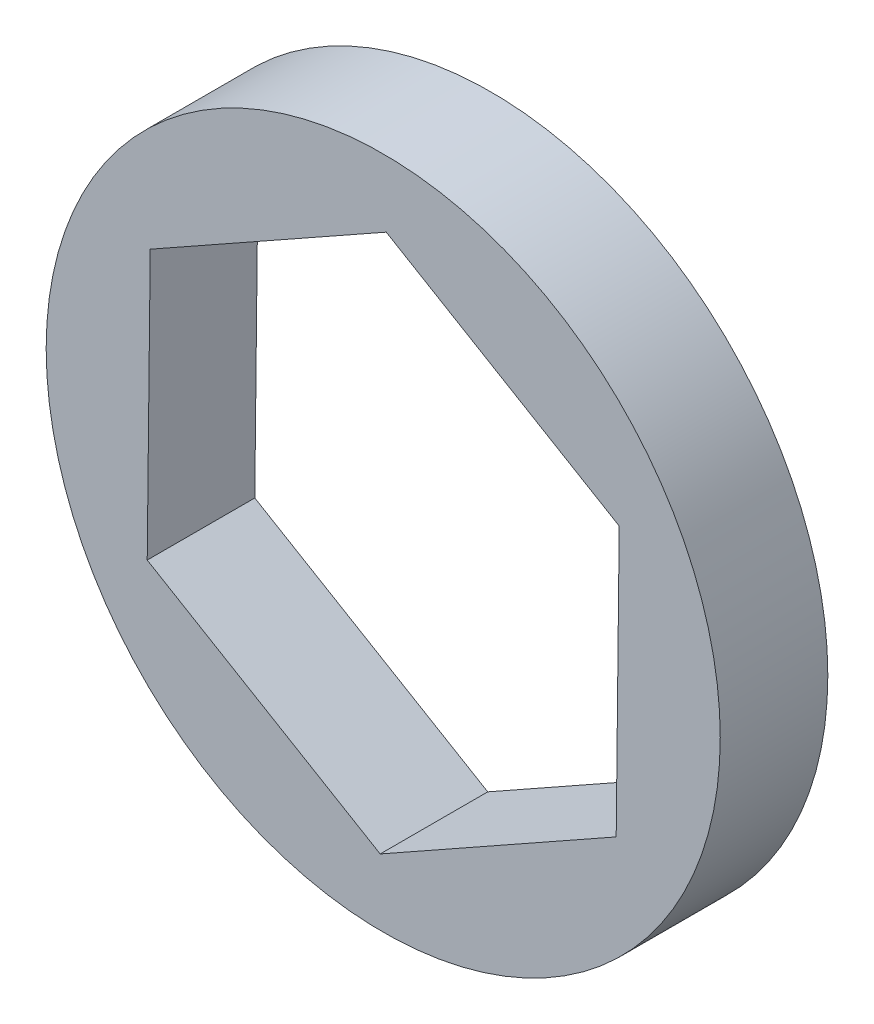
ISO-10303-21;
HEADER;
FILE_DESCRIPTION(('STEP AP214'),'2;1');
FILE_NAME('part.step','',(''),(''),'','','');
FILE_SCHEMA(('AUTOMOTIVE_DESIGN { 1 0 10303 214 1 1 1 1 }'));
ENDSEC;
DATA;
#1=APPLICATION_CONTEXT('core data for automotive mechanical design processes');
#2=APPLICATION_PROTOCOL_DEFINITION('international standard','automotive_design',2000,#1);
#3=PRODUCT_CONTEXT('',#1,'mechanical');
#4=PRODUCT('Part','Part','',(#3));
#5=PRODUCT_RELATED_PRODUCT_CATEGORY('part','',(#4));
#6=PRODUCT_DEFINITION_FORMATION('','',#4);
#7=PRODUCT_DEFINITION_CONTEXT('part definition',#1,'design');
#8=PRODUCT_DEFINITION('design','',#6,#7);
#9=PRODUCT_DEFINITION_SHAPE('','',#8);
#10=(LENGTH_UNIT() NAMED_UNIT(*) SI_UNIT(.MILLI.,.METRE.));
#11=(NAMED_UNIT(*) PLANE_ANGLE_UNIT() SI_UNIT($,.RADIAN.));
#12=(NAMED_UNIT(*) SI_UNIT($,.STERADIAN.) SOLID_ANGLE_UNIT());
#13=UNCERTAINTY_MEASURE_WITH_UNIT(LENGTH_MEASURE(1.E-05),#10,'distance_accuracy_value','');
#14=(GEOMETRIC_REPRESENTATION_CONTEXT(3) GLOBAL_UNCERTAINTY_ASSIGNED_CONTEXT((#13)) GLOBAL_UNIT_ASSIGNED_CONTEXT((#10,
#11,#12)) REPRESENTATION_CONTEXT('',''));
#15=CARTESIAN_POINT('',(0.,0.,0.));
#16=DIRECTION('',(0.,0.,1.));
#17=DIRECTION('',(1.,0.,0.));
#18=AXIS2_PLACEMENT_3D('',#15,#16,#17);
#19=CARTESIAN_POINT('',(0.,0.,3.));
#20=DIRECTION('',(0.,0.,1.));
#21=DIRECTION('',(1.,0.,0.));
#22=AXIS2_PLACEMENT_3D('',#19,#20,#21);
#23=PLANE('',#22);
#24=CARTESIAN_POINT('',(0.,0.,3.));
#25=DIRECTION('',(0.,0.,1.));
#26=DIRECTION('',(1.,0.,0.));
#27=AXIS2_PLACEMENT_3D('',#24,#25,#26);
#28=CIRCLE('',#27,9.4);
#29=CARTESIAN_POINT('',(9.4,0.,3.));
#30=VERTEX_POINT('',#29);
#31=EDGE_CURVE('E11',#30,#30,#28,.T.);
#32=ORIENTED_EDGE('',*,*,#31,.T.);
#33=EDGE_LOOP('',(#32));
#34=FACE_BOUND('',#33,.T.);
#35=DIRECTION('',(0.0112070766876811,0.999937198744059,0.));
#36=VECTOR('',#35,1.);
#37=CARTESIAN_POINT('',(6.49727280661045,-3.84892791261156,3.));
#38=LINE('',#37,#36);
#39=CARTESIAN_POINT('',(6.49727280661045,-3.84892791261156,3.));
#40=VERTEX_POINT('',#39);
#41=CARTESIAN_POINT('',(6.58190575296185,3.70233934953669,3.));
#42=VERTEX_POINT('',#41);
#43=EDGE_CURVE('E95',#40,#42,#38,.T.);
#44=ORIENTED_EDGE('',*,*,#43,.F.);
#45=DIRECTION('',(0.871574554645245,0.490262986258337,0.));
#46=VECTOR('',#45,1.);
#47=CARTESIAN_POINT('',(-0.0846329463513975,-7.55126726214825,3.));
#48=LINE('',#47,#46);
#49=CARTESIAN_POINT('',(-0.0846329463513975,-7.55126726214825,3.));
#50=VERTEX_POINT('',#49);
#51=EDGE_CURVE('E87',#50,#40,#48,.T.);
#52=ORIENTED_EDGE('',*,*,#51,.F.);
#53=DIRECTION('',(0.860367477957564,-0.509674212485722,0.));
#54=VECTOR('',#53,1.);
#55=CARTESIAN_POINT('',(-6.58190575296185,-3.70233934953669,3.));
#56=LINE('',#55,#54);
#57=CARTESIAN_POINT('',(-6.58190575296185,-3.70233934953669,3.));
#58=VERTEX_POINT('',#57);
#59=EDGE_CURVE('E115',#58,#50,#56,.T.);
#60=ORIENTED_EDGE('',*,*,#59,.F.);
#61=DIRECTION('',(-0.0112070766876816,-0.999937198744059,0.));
#62=VECTOR('',#61,1.);
#63=CARTESIAN_POINT('',(-6.49727280661045,3.84892791261156,3.));
#64=LINE('',#63,#62);
#65=CARTESIAN_POINT('',(-6.49727280661045,3.84892791261156,3.));
#66=VERTEX_POINT('',#65);
#67=EDGE_CURVE('E113',#66,#58,#64,.T.);
#68=ORIENTED_EDGE('',*,*,#67,.F.);
#69=DIRECTION('',(-0.871574554645245,-0.490262986258337,0.));
#70=VECTOR('',#69,1.);
#71=CARTESIAN_POINT('',(0.0846329463513967,7.55126726214825,3.));
#72=LINE('',#71,#70);
#73=CARTESIAN_POINT('',(0.0846329463513967,7.55126726214825,3.));
#74=VERTEX_POINT('',#73);
#75=EDGE_CURVE('E109',#74,#66,#72,.T.);
#76=ORIENTED_EDGE('',*,*,#75,.F.);
#77=DIRECTION('',(-0.860367477957564,0.509674212485722,0.));
#78=VECTOR('',#77,1.);
#79=CARTESIAN_POINT('',(6.58190575296185,3.70233934953669,3.));
#80=LINE('',#79,#78);
#81=EDGE_CURVE('E107',#42,#74,#80,.T.);
#82=ORIENTED_EDGE('',*,*,#81,.F.);
#83=EDGE_LOOP('',(#44,#52,#60,#68,#76,#82));
#84=FACE_BOUND('',#83,.T.);
#85=ADVANCED_FACE('F34',(#34,#84),#23,.T.);
#86=CARTESIAN_POINT('',(0.,0.,0.));
#87=DIRECTION('',(0.,0.,1.));
#88=DIRECTION('',(1.,0.,0.));
#89=AXIS2_PLACEMENT_3D('',#86,#87,#88);
#90=PLANE('',#89);
#91=CARTESIAN_POINT('',(0.,0.,0.));
#92=DIRECTION('',(0.,0.,1.));
#93=DIRECTION('',(1.,0.,0.));
#94=AXIS2_PLACEMENT_3D('',#91,#92,#93);
#95=CIRCLE('',#94,9.4);
#96=CARTESIAN_POINT('',(9.4,0.,0.));
#97=VERTEX_POINT('',#96);
#98=EDGE_CURVE('E38',#97,#97,#95,.T.);
#99=ORIENTED_EDGE('',*,*,#98,.F.);
#100=EDGE_LOOP('',(#99));
#101=FACE_BOUND('',#100,.T.);
#102=DIRECTION('',(0.871574554645245,0.490262986258337,0.));
#103=VECTOR('',#102,1.);
#104=CARTESIAN_POINT('',(-0.0846329463513975,-7.55126726214825,0.));
#105=LINE('',#104,#103);
#106=CARTESIAN_POINT('',(-0.0846329463513977,-7.55126726214825,0.));
#107=VERTEX_POINT('',#106);
#108=CARTESIAN_POINT('',(6.49727280661045,-3.84892791261156,0.));
#109=VERTEX_POINT('',#108);
#110=EDGE_CURVE('E57',#107,#109,#105,.T.);
#111=ORIENTED_EDGE('',*,*,#110,.T.);
#112=DIRECTION('',(0.0112070766876811,0.999937198744059,0.));
#113=VECTOR('',#112,1.);
#114=CARTESIAN_POINT('',(6.49727280661045,-3.84892791261156,0.));
#115=LINE('',#114,#113);
#116=CARTESIAN_POINT('',(6.58190575296185,3.70233934953669,0.));
#117=VERTEX_POINT('',#116);
#118=EDGE_CURVE('E102',#109,#117,#115,.T.);
#119=ORIENTED_EDGE('',*,*,#118,.T.);
#120=DIRECTION('',(-0.860367477957564,0.509674212485722,0.));
#121=VECTOR('',#120,1.);
#122=CARTESIAN_POINT('',(6.58190575296185,3.70233934953669,0.));
#123=LINE('',#122,#121);
#124=CARTESIAN_POINT('',(0.0846329463513967,7.55126726214825,0.));
#125=VERTEX_POINT('',#124);
#126=EDGE_CURVE('E119',#117,#125,#123,.T.);
#127=ORIENTED_EDGE('',*,*,#126,.T.);
#128=DIRECTION('',(-0.871574554645245,-0.490262986258337,0.));
#129=VECTOR('',#128,1.);
#130=CARTESIAN_POINT('',(0.0846329463513967,7.55126726214825,0.));
#131=LINE('',#130,#129);
#132=CARTESIAN_POINT('',(-6.49727280661045,3.84892791261156,0.));
#133=VERTEX_POINT('',#132);
#134=EDGE_CURVE('E122',#125,#133,#131,.T.);
#135=ORIENTED_EDGE('',*,*,#134,.T.);
#136=DIRECTION('',(-0.0112070766876816,-0.999937198744059,0.));
#137=VECTOR('',#136,1.);
#138=CARTESIAN_POINT('',(-6.49727280661045,3.84892791261156,0.));
#139=LINE('',#138,#137);
#140=CARTESIAN_POINT('',(-6.58190575296185,-3.70233934953669,0.));
#141=VERTEX_POINT('',#140);
#142=EDGE_CURVE('E125',#133,#141,#139,.T.);
#143=ORIENTED_EDGE('',*,*,#142,.T.);
#144=DIRECTION('',(0.860367477957564,-0.509674212485722,0.));
#145=VECTOR('',#144,1.);
#146=CARTESIAN_POINT('',(-6.58190575296185,-3.70233934953669,0.));
#147=LINE('',#146,#145);
#148=EDGE_CURVE('E96',#141,#107,#147,.T.);
#149=ORIENTED_EDGE('',*,*,#148,.T.);
#150=EDGE_LOOP('',(#111,#119,#127,#135,#143,#149));
#151=FACE_BOUND('',#150,.T.);
#152=ADVANCED_FACE('F142',(#101,#151),#90,.F.);
#153=CARTESIAN_POINT('',(0.,0.,3.));
#154=DIRECTION('',(0.,0.,-1.));
#155=DIRECTION('',(-1.,0.,0.));
#156=AXIS2_PLACEMENT_3D('',#153,#154,#155);
#157=CYLINDRICAL_SURFACE('',#156,9.4);
#158=ORIENTED_EDGE('',*,*,#31,.F.);
#159=EDGE_LOOP('',(#158));
#160=FACE_BOUND('',#159,.T.);
#161=ORIENTED_EDGE('',*,*,#98,.T.);
#162=EDGE_LOOP('',(#161));
#163=FACE_BOUND('',#162,.T.);
#164=ADVANCED_FACE('F36',(#160,#163),#157,.T.);
#165=CARTESIAN_POINT('',(-0.0846329463513975,-7.55126726214825,3.));
#166=DIRECTION('',(-0.490262986258337,0.871574554645245,0.));
#167=DIRECTION('',(-0.871574554645245,-0.490262986258337,0.));
#168=AXIS2_PLACEMENT_3D('',#165,#166,#167);
#169=PLANE('',#168);
#170=ORIENTED_EDGE('',*,*,#110,.F.);
#171=DIRECTION('',(0.,0.,-1.));
#172=VECTOR('',#171,1.);
#173=CARTESIAN_POINT('',(-0.0846329463513975,-7.55126726214825,3.));
#174=LINE('',#173,#172);
#175=EDGE_CURVE('E91',#50,#107,#174,.T.);
#176=ORIENTED_EDGE('',*,*,#175,.F.);
#177=ORIENTED_EDGE('',*,*,#51,.T.);
#178=DIRECTION('',(0.,0.,-1.));
#179=VECTOR('',#178,1.);
#180=CARTESIAN_POINT('',(6.49727280661045,-3.84892791261156,3.));
#181=LINE('',#180,#179);
#182=EDGE_CURVE('E90',#40,#109,#181,.T.);
#183=ORIENTED_EDGE('',*,*,#182,.T.);
#184=EDGE_LOOP('',(#170,#176,#177,#183));
#185=FACE_BOUND('',#184,.T.);
#186=ADVANCED_FACE('F89',(#185),#169,.T.);
#187=CARTESIAN_POINT('',(6.49727280661045,-3.84892791261156,3.));
#188=DIRECTION('',(-0.999937198744059,0.0112070766876811,0.));
#189=DIRECTION('',(-0.0112070766876811,-0.999937198744059,0.));
#190=AXIS2_PLACEMENT_3D('',#187,#188,#189);
#191=PLANE('',#190);
#192=ORIENTED_EDGE('',*,*,#118,.F.);
#193=ORIENTED_EDGE('',*,*,#182,.F.);
#194=ORIENTED_EDGE('',*,*,#43,.T.);
#195=DIRECTION('',(0.,0.,-1.));
#196=VECTOR('',#195,1.);
#197=CARTESIAN_POINT('',(6.58190575296185,3.70233934953669,3.));
#198=LINE('',#197,#196);
#199=EDGE_CURVE('E103',#42,#117,#198,.T.);
#200=ORIENTED_EDGE('',*,*,#199,.T.);
#201=EDGE_LOOP('',(#192,#193,#194,#200));
#202=FACE_BOUND('',#201,.T.);
#203=ADVANCED_FACE('F99',(#202),#191,.T.);
#204=CARTESIAN_POINT('',(6.58190575296185,3.70233934953669,3.));
#205=DIRECTION('',(-0.509674212485722,-0.860367477957564,0.));
#206=DIRECTION('',(0.860367477957564,-0.509674212485722,0.));
#207=AXIS2_PLACEMENT_3D('',#204,#205,#206);
#208=PLANE('',#207);
#209=ORIENTED_EDGE('',*,*,#126,.F.);
#210=ORIENTED_EDGE('',*,*,#199,.F.);
#211=ORIENTED_EDGE('',*,*,#81,.T.);
#212=DIRECTION('',(0.,0.,-1.));
#213=VECTOR('',#212,1.);
#214=CARTESIAN_POINT('',(0.0846329463513967,7.55126726214825,3.));
#215=LINE('',#214,#213);
#216=EDGE_CURVE('E134',#74,#125,#215,.T.);
#217=ORIENTED_EDGE('',*,*,#216,.T.);
#218=EDGE_LOOP('',(#209,#210,#211,#217));
#219=FACE_BOUND('',#218,.T.);
#220=ADVANCED_FACE('F138',(#219),#208,.T.);
#221=CARTESIAN_POINT('',(0.0846329463513967,7.55126726214825,3.));
#222=DIRECTION('',(0.490262986258337,-0.871574554645245,0.));
#223=DIRECTION('',(0.871574554645245,0.490262986258337,0.));
#224=AXIS2_PLACEMENT_3D('',#221,#222,#223);
#225=PLANE('',#224);
#226=ORIENTED_EDGE('',*,*,#134,.F.);
#227=ORIENTED_EDGE('',*,*,#216,.F.);
#228=ORIENTED_EDGE('',*,*,#75,.T.);
#229=DIRECTION('',(0.,0.,-1.));
#230=VECTOR('',#229,1.);
#231=CARTESIAN_POINT('',(-6.49727280661045,3.84892791261156,3.));
#232=LINE('',#231,#230);
#233=EDGE_CURVE('E132',#66,#133,#232,.T.);
#234=ORIENTED_EDGE('',*,*,#233,.T.);
#235=EDGE_LOOP('',(#226,#227,#228,#234));
#236=FACE_BOUND('',#235,.T.);
#237=ADVANCED_FACE('F150',(#236),#225,.T.);
#238=CARTESIAN_POINT('',(-6.49727280661045,3.84892791261156,3.));
#239=DIRECTION('',(0.999937198744059,-0.0112070766876816,0.));
#240=DIRECTION('',(0.0112070766876816,0.99993719874406,0.));
#241=AXIS2_PLACEMENT_3D('',#238,#239,#240);
#242=PLANE('',#241);
#243=ORIENTED_EDGE('',*,*,#142,.F.);
#244=ORIENTED_EDGE('',*,*,#233,.F.);
#245=ORIENTED_EDGE('',*,*,#67,.T.);
#246=DIRECTION('',(0.,0.,-1.));
#247=VECTOR('',#246,1.);
#248=CARTESIAN_POINT('',(-6.58190575296185,-3.70233934953669,3.));
#249=LINE('',#248,#247);
#250=EDGE_CURVE('E49',#58,#141,#249,.T.);
#251=ORIENTED_EDGE('',*,*,#250,.T.);
#252=EDGE_LOOP('',(#243,#244,#245,#251));
#253=FACE_BOUND('',#252,.T.);
#254=ADVANCED_FACE('F148',(#253),#242,.T.);
#255=CARTESIAN_POINT('',(-6.58190575296185,-3.70233934953669,3.));
#256=DIRECTION('',(0.509674212485722,0.860367477957564,0.));
#257=DIRECTION('',(-0.860367477957564,0.509674212485722,0.));
#258=AXIS2_PLACEMENT_3D('',#255,#256,#257);
#259=PLANE('',#258);
#260=ORIENTED_EDGE('',*,*,#148,.F.);
#261=ORIENTED_EDGE('',*,*,#250,.F.);
#262=ORIENTED_EDGE('',*,*,#59,.T.);
#263=ORIENTED_EDGE('',*,*,#175,.T.);
#264=EDGE_LOOP('',(#260,#261,#262,#263));
#265=FACE_BOUND('',#264,.T.);
#266=ADVANCED_FACE('F144',(#265),#259,.T.);
#267=CLOSED_SHELL('',(#85,#152,#164,#186,#203,#220,#237,#254,#266));
#268=MANIFOLD_SOLID_BREP('B2',#267);
#269=ADVANCED_BREP_SHAPE_REPRESENTATION('',(#18,#268),#14);
#270=SHAPE_DEFINITION_REPRESENTATION(#9,#269);
ENDSEC;
END-ISO-10303-21;
